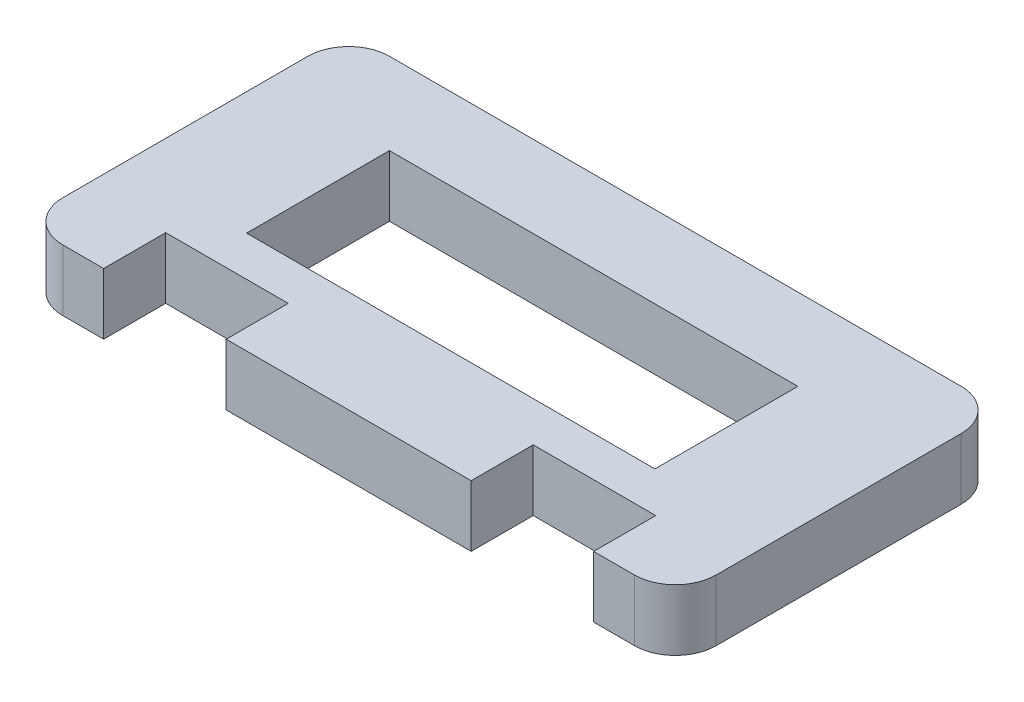
ISO-10303-21;
HEADER;
FILE_DESCRIPTION(('STEP AP214'),'2;1');
FILE_NAME('part.step','',(''),(''),'','','');
FILE_SCHEMA(('AUTOMOTIVE_DESIGN { 1 0 10303 214 1 1 1 1 }'));
ENDSEC;
DATA;
#1=APPLICATION_CONTEXT('core data for automotive mechanical design processes');
#2=APPLICATION_PROTOCOL_DEFINITION('international standard','automotive_design',2000,#1);
#3=PRODUCT_CONTEXT('',#1,'mechanical');
#4=PRODUCT('Part','Part','',(#3));
#5=PRODUCT_RELATED_PRODUCT_CATEGORY('part','',(#4));
#6=PRODUCT_DEFINITION_FORMATION('','',#4);
#7=PRODUCT_DEFINITION_CONTEXT('part definition',#1,'design');
#8=PRODUCT_DEFINITION('design','',#6,#7);
#9=PRODUCT_DEFINITION_SHAPE('','',#8);
#10=(LENGTH_UNIT() NAMED_UNIT(*) SI_UNIT(.MILLI.,.METRE.));
#11=(NAMED_UNIT(*) PLANE_ANGLE_UNIT() SI_UNIT($,.RADIAN.));
#12=(NAMED_UNIT(*) SI_UNIT($,.STERADIAN.) SOLID_ANGLE_UNIT());
#13=UNCERTAINTY_MEASURE_WITH_UNIT(LENGTH_MEASURE(1.E-05),#10,'distance_accuracy_value','');
#14=(GEOMETRIC_REPRESENTATION_CONTEXT(3) GLOBAL_UNCERTAINTY_ASSIGNED_CONTEXT((#13)) GLOBAL_UNIT_ASSIGNED_CONTEXT((#10,
#11,#12)) REPRESENTATION_CONTEXT('',''));
#15=CARTESIAN_POINT('',(0.,0.,0.));
#16=DIRECTION('',(0.,0.,1.));
#17=DIRECTION('',(1.,0.,0.));
#18=AXIS2_PLACEMENT_3D('',#15,#16,#17);
#19=CARTESIAN_POINT('',(-35.,7.5,15.));
#20=DIRECTION('',(0.,1.,0.));
#21=DIRECTION('',(0.,0.,1.));
#22=AXIS2_PLACEMENT_3D('',#19,#20,#21);
#23=PLANE('',#22);
#24=CARTESIAN_POINT('',(-35.,7.5,15.));
#25=DIRECTION('',(0.,1.,0.));
#26=DIRECTION('',(0.,0.,1.));
#27=AXIS2_PLACEMENT_3D('',#24,#25,#26);
#28=CIRCLE('',#27,5.);
#29=CARTESIAN_POINT('',(-40.,7.5,15.));
#30=VERTEX_POINT('',#29);
#31=CARTESIAN_POINT('',(-35.,7.5,20.));
#32=VERTEX_POINT('',#31);
#33=EDGE_CURVE('E225',#30,#32,#28,.T.);
#34=ORIENTED_EDGE('',*,*,#33,.T.);
#35=DIRECTION('',(1.,0.,0.));
#36=VECTOR('',#35,1.);
#37=CARTESIAN_POINT('',(-35.,7.5,20.));
#38=LINE('',#37,#36);
#39=CARTESIAN_POINT('',(-30.,7.5,20.));
#40=VERTEX_POINT('',#39);
#41=EDGE_CURVE('E229',#32,#40,#38,.T.);
#42=ORIENTED_EDGE('',*,*,#41,.T.);
#43=DIRECTION('',(0.,0.,-1.));
#44=VECTOR('',#43,1.);
#45=CARTESIAN_POINT('',(-30.,7.5,20.));
#46=LINE('',#45,#44);
#47=CARTESIAN_POINT('',(-30.,7.5,12.4));
#48=VERTEX_POINT('',#47);
#49=EDGE_CURVE('E233',#40,#48,#46,.T.);
#50=ORIENTED_EDGE('',*,*,#49,.T.);
#51=DIRECTION('',(1.,0.,0.));
#52=VECTOR('',#51,1.);
#53=CARTESIAN_POINT('',(-30.,7.5,12.4));
#54=LINE('',#53,#52);
#55=CARTESIAN_POINT('',(-15.,7.5,12.4));
#56=VERTEX_POINT('',#55);
#57=EDGE_CURVE('E236',#48,#56,#54,.T.);
#58=ORIENTED_EDGE('',*,*,#57,.T.);
#59=DIRECTION('',(0.,0.,1.));
#60=VECTOR('',#59,1.);
#61=CARTESIAN_POINT('',(-15.,7.5,12.4));
#62=LINE('',#61,#60);
#63=CARTESIAN_POINT('',(-15.,7.5,20.));
#64=VERTEX_POINT('',#63);
#65=EDGE_CURVE('E239',#56,#64,#62,.T.);
#66=ORIENTED_EDGE('',*,*,#65,.T.);
#67=DIRECTION('',(1.,0.,0.));
#68=VECTOR('',#67,1.);
#69=CARTESIAN_POINT('',(-15.,7.5,20.));
#70=LINE('',#69,#68);
#71=CARTESIAN_POINT('',(15.,7.5,20.));
#72=VERTEX_POINT('',#71);
#73=EDGE_CURVE('E242',#64,#72,#70,.T.);
#74=ORIENTED_EDGE('',*,*,#73,.T.);
#75=DIRECTION('',(0.,0.,-1.));
#76=VECTOR('',#75,1.);
#77=CARTESIAN_POINT('',(15.,7.5,12.4));
#78=LINE('',#77,#76);
#79=CARTESIAN_POINT('',(15.,7.5,12.4));
#80=VERTEX_POINT('',#79);
#81=EDGE_CURVE('E245',#72,#80,#78,.T.);
#82=ORIENTED_EDGE('',*,*,#81,.T.);
#83=DIRECTION('',(1.,0.,0.));
#84=VECTOR('',#83,1.);
#85=CARTESIAN_POINT('',(15.,7.5,12.4));
#86=LINE('',#85,#84);
#87=CARTESIAN_POINT('',(30.,7.5,12.4));
#88=VERTEX_POINT('',#87);
#89=EDGE_CURVE('E248',#80,#88,#86,.T.);
#90=ORIENTED_EDGE('',*,*,#89,.T.);
#91=DIRECTION('',(0.,0.,1.));
#92=VECTOR('',#91,1.);
#93=CARTESIAN_POINT('',(30.,7.5,20.));
#94=LINE('',#93,#92);
#95=CARTESIAN_POINT('',(30.,7.5,20.));
#96=VERTEX_POINT('',#95);
#97=EDGE_CURVE('E251',#88,#96,#94,.T.);
#98=ORIENTED_EDGE('',*,*,#97,.T.);
#99=DIRECTION('',(1.,0.,0.));
#100=VECTOR('',#99,1.);
#101=CARTESIAN_POINT('',(30.,7.5,20.));
#102=LINE('',#101,#100);
#103=CARTESIAN_POINT('',(35.,7.5,20.));
#104=VERTEX_POINT('',#103);
#105=EDGE_CURVE('E254',#96,#104,#102,.T.);
#106=ORIENTED_EDGE('',*,*,#105,.T.);
#107=CARTESIAN_POINT('',(35.,7.5,15.));
#108=DIRECTION('',(0.,1.,0.));
#109=DIRECTION('',(0.,0.,1.));
#110=AXIS2_PLACEMENT_3D('',#107,#108,#109);
#111=CIRCLE('',#110,5.);
#112=CARTESIAN_POINT('',(40.,7.5,15.));
#113=VERTEX_POINT('',#112);
#114=EDGE_CURVE('E257',#104,#113,#111,.T.);
#115=ORIENTED_EDGE('',*,*,#114,.T.);
#116=DIRECTION('',(0.,0.,-1.));
#117=VECTOR('',#116,1.);
#118=CARTESIAN_POINT('',(40.,7.5,-15.));
#119=LINE('',#118,#117);
#120=CARTESIAN_POINT('',(40.,7.5,-15.));
#121=VERTEX_POINT('',#120);
#122=EDGE_CURVE('E260',#113,#121,#119,.T.);
#123=ORIENTED_EDGE('',*,*,#122,.T.);
#124=CARTESIAN_POINT('',(35.,7.5,-15.));
#125=DIRECTION('',(0.,1.,0.));
#126=DIRECTION('',(0.,0.,-1.));
#127=AXIS2_PLACEMENT_3D('',#124,#125,#126);
#128=CIRCLE('',#127,5.);
#129=CARTESIAN_POINT('',(35.,7.5,-20.));
#130=VERTEX_POINT('',#129);
#131=EDGE_CURVE('E263',#121,#130,#128,.T.);
#132=ORIENTED_EDGE('',*,*,#131,.T.);
#133=DIRECTION('',(-1.,0.,0.));
#134=VECTOR('',#133,1.);
#135=CARTESIAN_POINT('',(-35.,7.5,-20.));
#136=LINE('',#135,#134);
#137=CARTESIAN_POINT('',(-35.,7.5,-20.));
#138=VERTEX_POINT('',#137);
#139=EDGE_CURVE('E266',#130,#138,#136,.T.);
#140=ORIENTED_EDGE('',*,*,#139,.T.);
#141=CARTESIAN_POINT('',(-35.,7.5,-15.));
#142=DIRECTION('',(0.,1.,0.));
#143=DIRECTION('',(0.,0.,1.));
#144=AXIS2_PLACEMENT_3D('',#141,#142,#143);
#145=CIRCLE('',#144,5.);
#146=CARTESIAN_POINT('',(-40.,7.5,-15.));
#147=VERTEX_POINT('',#146);
#148=EDGE_CURVE('E269',#138,#147,#145,.T.);
#149=ORIENTED_EDGE('',*,*,#148,.T.);
#150=DIRECTION('',(0.,0.,1.));
#151=VECTOR('',#150,1.);
#152=CARTESIAN_POINT('',(-40.,7.5,-15.));
#153=LINE('',#152,#151);
#154=EDGE_CURVE('E272',#147,#30,#153,.T.);
#155=ORIENTED_EDGE('',*,*,#154,.T.);
#156=EDGE_LOOP('',(#34,#42,#50,#58,#66,#74,#82,#90,#98,#106,#115,#123,#132,#140,#149,#155));
#157=FACE_BOUND('',#156,.T.);
#158=DIRECTION('',(-1.,0.,0.));
#159=VECTOR('',#158,1.);
#160=CARTESIAN_POINT('',(-25.,7.5,-10.));
#161=LINE('',#160,#159);
#162=CARTESIAN_POINT('',(25.,7.5,-10.));
#163=VERTEX_POINT('',#162);
#164=CARTESIAN_POINT('',(-25.,7.5,-10.));
#165=VERTEX_POINT('',#164);
#166=EDGE_CURVE('E186',#163,#165,#161,.T.);
#167=ORIENTED_EDGE('',*,*,#166,.F.);
#168=DIRECTION('',(0.,0.,-1.));
#169=VECTOR('',#168,1.);
#170=CARTESIAN_POINT('',(25.,7.5,-10.));
#171=LINE('',#170,#169);
#172=CARTESIAN_POINT('',(25.,7.5,7.5));
#173=VERTEX_POINT('',#172);
#174=EDGE_CURVE('E177',#173,#163,#171,.T.);
#175=ORIENTED_EDGE('',*,*,#174,.F.);
#176=DIRECTION('',(1.,0.,0.));
#177=VECTOR('',#176,1.);
#178=CARTESIAN_POINT('',(-25.,7.5,7.5));
#179=LINE('',#178,#177);
#180=CARTESIAN_POINT('',(-25.,7.5,7.5));
#181=VERTEX_POINT('',#180);
#182=EDGE_CURVE('E203',#181,#173,#179,.T.);
#183=ORIENTED_EDGE('',*,*,#182,.F.);
#184=DIRECTION('',(0.,0.,1.));
#185=VECTOR('',#184,1.);
#186=CARTESIAN_POINT('',(-25.,7.5,-10.));
#187=LINE('',#186,#185);
#188=EDGE_CURVE('E199',#165,#181,#187,.T.);
#189=ORIENTED_EDGE('',*,*,#188,.F.);
#190=EDGE_LOOP('',(#167,#175,#183,#189));
#191=FACE_BOUND('',#190,.T.);
#192=ADVANCED_FACE('F39',(#157,#191),#23,.T.);
#193=CARTESIAN_POINT('',(-35.,0.,15.));
#194=DIRECTION('',(0.,1.,0.));
#195=DIRECTION('',(0.,0.,1.));
#196=AXIS2_PLACEMENT_3D('',#193,#194,#195);
#197=PLANE('',#196);
#198=CARTESIAN_POINT('',(-35.,0.,15.));
#199=DIRECTION('',(0.,1.,0.));
#200=DIRECTION('',(0.,0.,1.));
#201=AXIS2_PLACEMENT_3D('',#198,#199,#200);
#202=CIRCLE('',#201,5.);
#203=CARTESIAN_POINT('',(-40.,0.,15.));
#204=VERTEX_POINT('',#203);
#205=CARTESIAN_POINT('',(-35.,0.,20.));
#206=VERTEX_POINT('',#205);
#207=EDGE_CURVE('E195',#204,#206,#202,.T.);
#208=ORIENTED_EDGE('',*,*,#207,.F.);
#209=DIRECTION('',(0.,0.,1.));
#210=VECTOR('',#209,1.);
#211=CARTESIAN_POINT('',(-40.,0.,-15.));
#212=LINE('',#211,#210);
#213=CARTESIAN_POINT('',(-40.,0.,-15.));
#214=VERTEX_POINT('',#213);
#215=EDGE_CURVE('E230',#214,#204,#212,.T.);
#216=ORIENTED_EDGE('',*,*,#215,.F.);
#217=CARTESIAN_POINT('',(-35.,0.,-15.));
#218=DIRECTION('',(0.,1.,0.));
#219=DIRECTION('',(0.,0.,1.));
#220=AXIS2_PLACEMENT_3D('',#217,#218,#219);
#221=CIRCLE('',#220,5.);
#222=CARTESIAN_POINT('',(-35.,0.,-20.));
#223=VERTEX_POINT('',#222);
#224=EDGE_CURVE('E318',#223,#214,#221,.T.);
#225=ORIENTED_EDGE('',*,*,#224,.F.);
#226=DIRECTION('',(-1.,0.,0.));
#227=VECTOR('',#226,1.);
#228=CARTESIAN_POINT('',(-35.,0.,-20.));
#229=LINE('',#228,#227);
#230=CARTESIAN_POINT('',(35.,0.,-20.));
#231=VERTEX_POINT('',#230);
#232=EDGE_CURVE('E315',#231,#223,#229,.T.);
#233=ORIENTED_EDGE('',*,*,#232,.F.);
#234=CARTESIAN_POINT('',(35.,0.,-15.));
#235=DIRECTION('',(0.,1.,0.));
#236=DIRECTION('',(0.,0.,-1.));
#237=AXIS2_PLACEMENT_3D('',#234,#235,#236);
#238=CIRCLE('',#237,5.);
#239=CARTESIAN_POINT('',(40.,0.,-15.));
#240=VERTEX_POINT('',#239);
#241=EDGE_CURVE('E312',#240,#231,#238,.T.);
#242=ORIENTED_EDGE('',*,*,#241,.F.);
#243=DIRECTION('',(0.,0.,-1.));
#244=VECTOR('',#243,1.);
#245=CARTESIAN_POINT('',(40.,0.,-15.));
#246=LINE('',#245,#244);
#247=CARTESIAN_POINT('',(40.,0.,15.));
#248=VERTEX_POINT('',#247);
#249=EDGE_CURVE('E309',#248,#240,#246,.T.);
#250=ORIENTED_EDGE('',*,*,#249,.F.);
#251=CARTESIAN_POINT('',(35.,0.,15.));
#252=DIRECTION('',(0.,1.,0.));
#253=DIRECTION('',(0.,0.,1.));
#254=AXIS2_PLACEMENT_3D('',#251,#252,#253);
#255=CIRCLE('',#254,5.);
#256=CARTESIAN_POINT('',(35.,0.,20.));
#257=VERTEX_POINT('',#256);
#258=EDGE_CURVE('E306',#257,#248,#255,.T.);
#259=ORIENTED_EDGE('',*,*,#258,.F.);
#260=DIRECTION('',(1.,0.,0.));
#261=VECTOR('',#260,1.);
#262=CARTESIAN_POINT('',(30.,0.,20.));
#263=LINE('',#262,#261);
#264=CARTESIAN_POINT('',(30.,0.,20.));
#265=VERTEX_POINT('',#264);
#266=EDGE_CURVE('E303',#265,#257,#263,.T.);
#267=ORIENTED_EDGE('',*,*,#266,.F.);
#268=DIRECTION('',(0.,0.,1.));
#269=VECTOR('',#268,1.);
#270=CARTESIAN_POINT('',(30.,0.,20.));
#271=LINE('',#270,#269);
#272=CARTESIAN_POINT('',(30.,0.,12.4));
#273=VERTEX_POINT('',#272);
#274=EDGE_CURVE('E300',#273,#265,#271,.T.);
#275=ORIENTED_EDGE('',*,*,#274,.F.);
#276=DIRECTION('',(1.,0.,0.));
#277=VECTOR('',#276,1.);
#278=CARTESIAN_POINT('',(15.,0.,12.4));
#279=LINE('',#278,#277);
#280=CARTESIAN_POINT('',(15.,0.,12.4));
#281=VERTEX_POINT('',#280);
#282=EDGE_CURVE('E297',#281,#273,#279,.T.);
#283=ORIENTED_EDGE('',*,*,#282,.F.);
#284=DIRECTION('',(0.,0.,-1.));
#285=VECTOR('',#284,1.);
#286=CARTESIAN_POINT('',(15.,0.,12.4));
#287=LINE('',#286,#285);
#288=CARTESIAN_POINT('',(15.,0.,20.));
#289=VERTEX_POINT('',#288);
#290=EDGE_CURVE('E294',#289,#281,#287,.T.);
#291=ORIENTED_EDGE('',*,*,#290,.F.);
#292=DIRECTION('',(1.,0.,0.));
#293=VECTOR('',#292,1.);
#294=CARTESIAN_POINT('',(-15.,0.,20.));
#295=LINE('',#294,#293);
#296=CARTESIAN_POINT('',(-15.,0.,20.));
#297=VERTEX_POINT('',#296);
#298=EDGE_CURVE('E291',#297,#289,#295,.T.);
#299=ORIENTED_EDGE('',*,*,#298,.F.);
#300=DIRECTION('',(0.,0.,1.));
#301=VECTOR('',#300,1.);
#302=CARTESIAN_POINT('',(-15.,0.,12.4));
#303=LINE('',#302,#301);
#304=CARTESIAN_POINT('',(-15.,0.,12.4));
#305=VERTEX_POINT('',#304);
#306=EDGE_CURVE('E288',#305,#297,#303,.T.);
#307=ORIENTED_EDGE('',*,*,#306,.F.);
#308=DIRECTION('',(1.,0.,0.));
#309=VECTOR('',#308,1.);
#310=CARTESIAN_POINT('',(-30.,0.,12.4));
#311=LINE('',#310,#309);
#312=CARTESIAN_POINT('',(-30.,0.,12.4));
#313=VERTEX_POINT('',#312);
#314=EDGE_CURVE('E285',#313,#305,#311,.T.);
#315=ORIENTED_EDGE('',*,*,#314,.F.);
#316=DIRECTION('',(0.,0.,-1.));
#317=VECTOR('',#316,1.);
#318=CARTESIAN_POINT('',(-30.,0.,20.));
#319=LINE('',#318,#317);
#320=CARTESIAN_POINT('',(-30.,0.,20.));
#321=VERTEX_POINT('',#320);
#322=EDGE_CURVE('E282',#321,#313,#319,.T.);
#323=ORIENTED_EDGE('',*,*,#322,.F.);
#324=DIRECTION('',(1.,0.,0.));
#325=VECTOR('',#324,1.);
#326=CARTESIAN_POINT('',(-35.,0.,20.));
#327=LINE('',#326,#325);
#328=EDGE_CURVE('E279',#206,#321,#327,.T.);
#329=ORIENTED_EDGE('',*,*,#328,.F.);
#330=EDGE_LOOP('',(#208,#216,#225,#233,#242,#250,#259,#267,#275,#283,#291,#299,#307,#315,#323,#329));
#331=FACE_BOUND('',#330,.T.);
#332=DIRECTION('',(0.,0.,-1.));
#333=VECTOR('',#332,1.);
#334=CARTESIAN_POINT('',(25.,0.,-10.));
#335=LINE('',#334,#333);
#336=CARTESIAN_POINT('',(25.,0.,7.5));
#337=VERTEX_POINT('',#336);
#338=CARTESIAN_POINT('',(25.,0.,-10.));
#339=VERTEX_POINT('',#338);
#340=EDGE_CURVE('E63',#337,#339,#335,.T.);
#341=ORIENTED_EDGE('',*,*,#340,.T.);
#342=DIRECTION('',(-1.,0.,0.));
#343=VECTOR('',#342,1.);
#344=CARTESIAN_POINT('',(-25.,0.,-10.));
#345=LINE('',#344,#343);
#346=CARTESIAN_POINT('',(-25.,0.,-10.));
#347=VERTEX_POINT('',#346);
#348=EDGE_CURVE('E193',#339,#347,#345,.T.);
#349=ORIENTED_EDGE('',*,*,#348,.T.);
#350=DIRECTION('',(0.,0.,1.));
#351=VECTOR('',#350,1.);
#352=CARTESIAN_POINT('',(-25.,0.,-10.));
#353=LINE('',#352,#351);
#354=CARTESIAN_POINT('',(-25.,0.,7.5));
#355=VERTEX_POINT('',#354);
#356=EDGE_CURVE('E212',#347,#355,#353,.T.);
#357=ORIENTED_EDGE('',*,*,#356,.T.);
#358=DIRECTION('',(1.,0.,0.));
#359=VECTOR('',#358,1.);
#360=CARTESIAN_POINT('',(-25.,0.,7.5));
#361=LINE('',#360,#359);
#362=EDGE_CURVE('E187',#355,#337,#361,.T.);
#363=ORIENTED_EDGE('',*,*,#362,.T.);
#364=EDGE_LOOP('',(#341,#349,#357,#363));
#365=FACE_BOUND('',#364,.T.);
#366=ADVANCED_FACE('F389',(#331,#365),#197,.F.);
#367=CARTESIAN_POINT('',(-35.,7.5,15.));
#368=DIRECTION('',(0.,-1.,0.));
#369=DIRECTION('',(0.,0.,-1.));
#370=AXIS2_PLACEMENT_3D('',#367,#368,#369);
#371=CYLINDRICAL_SURFACE('',#370,5.);
#372=ORIENTED_EDGE('',*,*,#207,.T.);
#373=DIRECTION('',(0.,-1.,0.));
#374=VECTOR('',#373,1.);
#375=CARTESIAN_POINT('',(-35.,7.5,20.));
#376=LINE('',#375,#374);
#377=EDGE_CURVE('E11',#32,#206,#376,.T.);
#378=ORIENTED_EDGE('',*,*,#377,.F.);
#379=ORIENTED_EDGE('',*,*,#33,.F.);
#380=DIRECTION('',(0.,-1.,0.));
#381=VECTOR('',#380,1.);
#382=CARTESIAN_POINT('',(-40.,7.5,15.));
#383=LINE('',#382,#381);
#384=EDGE_CURVE('E275',#30,#204,#383,.T.);
#385=ORIENTED_EDGE('',*,*,#384,.T.);
#386=EDGE_LOOP('',(#372,#378,#379,#385));
#387=FACE_BOUND('',#386,.T.);
#388=ADVANCED_FACE('F41',(#387),#371,.T.);
#389=CARTESIAN_POINT('',(-35.,7.5,20.));
#390=DIRECTION('',(0.,0.,-1.));
#391=DIRECTION('',(-1.,0.,0.));
#392=AXIS2_PLACEMENT_3D('',#389,#390,#391);
#393=PLANE('',#392);
#394=ORIENTED_EDGE('',*,*,#328,.T.);
#395=DIRECTION('',(0.,-1.,0.));
#396=VECTOR('',#395,1.);
#397=CARTESIAN_POINT('',(-30.,7.5,20.));
#398=LINE('',#397,#396);
#399=EDGE_CURVE('E48',#40,#321,#398,.T.);
#400=ORIENTED_EDGE('',*,*,#399,.F.);
#401=ORIENTED_EDGE('',*,*,#41,.F.);
#402=ORIENTED_EDGE('',*,*,#377,.T.);
#403=EDGE_LOOP('',(#394,#400,#401,#402));
#404=FACE_BOUND('',#403,.T.);
#405=ADVANCED_FACE('F406',(#404),#393,.F.);
#406=CARTESIAN_POINT('',(-30.,7.5,20.));
#407=DIRECTION('',(-1.,0.,0.));
#408=DIRECTION('',(0.,0.,1.));
#409=AXIS2_PLACEMENT_3D('',#406,#407,#408);
#410=PLANE('',#409);
#411=ORIENTED_EDGE('',*,*,#322,.T.);
#412=DIRECTION('',(0.,-1.,0.));
#413=VECTOR('',#412,1.);
#414=CARTESIAN_POINT('',(-30.,7.5,12.4));
#415=LINE('',#414,#413);
#416=EDGE_CURVE('E374',#48,#313,#415,.T.);
#417=ORIENTED_EDGE('',*,*,#416,.F.);
#418=ORIENTED_EDGE('',*,*,#49,.F.);
#419=ORIENTED_EDGE('',*,*,#399,.T.);
#420=EDGE_LOOP('',(#411,#417,#418,#419));
#421=FACE_BOUND('',#420,.T.);
#422=ADVANCED_FACE('F383',(#421),#410,.F.);
#423=CARTESIAN_POINT('',(-30.,7.5,12.4));
#424=DIRECTION('',(0.,0.,-1.));
#425=DIRECTION('',(-1.,0.,0.));
#426=AXIS2_PLACEMENT_3D('',#423,#424,#425);
#427=PLANE('',#426);
#428=ORIENTED_EDGE('',*,*,#314,.T.);
#429=DIRECTION('',(0.,-1.,0.));
#430=VECTOR('',#429,1.);
#431=CARTESIAN_POINT('',(-15.,7.5,12.4));
#432=LINE('',#431,#430);
#433=EDGE_CURVE('E370',#56,#305,#432,.T.);
#434=ORIENTED_EDGE('',*,*,#433,.F.);
#435=ORIENTED_EDGE('',*,*,#57,.F.);
#436=ORIENTED_EDGE('',*,*,#416,.T.);
#437=EDGE_LOOP('',(#428,#434,#435,#436));
#438=FACE_BOUND('',#437,.T.);
#439=ADVANCED_FACE('F395',(#438),#427,.F.);
#440=CARTESIAN_POINT('',(-15.,7.5,12.4));
#441=DIRECTION('',(1.,0.,0.));
#442=DIRECTION('',(0.,0.,-1.));
#443=AXIS2_PLACEMENT_3D('',#440,#441,#442);
#444=PLANE('',#443);
#445=ORIENTED_EDGE('',*,*,#306,.T.);
#446=DIRECTION('',(0.,-1.,0.));
#447=VECTOR('',#446,1.);
#448=CARTESIAN_POINT('',(-15.,7.5,20.));
#449=LINE('',#448,#447);
#450=EDGE_CURVE('E366',#64,#297,#449,.T.);
#451=ORIENTED_EDGE('',*,*,#450,.F.);
#452=ORIENTED_EDGE('',*,*,#65,.F.);
#453=ORIENTED_EDGE('',*,*,#433,.T.);
#454=EDGE_LOOP('',(#445,#451,#452,#453));
#455=FACE_BOUND('',#454,.T.);
#456=ADVANCED_FACE('F399',(#455),#444,.F.);
#457=CARTESIAN_POINT('',(-15.,7.5,20.));
#458=DIRECTION('',(0.,0.,-1.));
#459=DIRECTION('',(-1.,0.,0.));
#460=AXIS2_PLACEMENT_3D('',#457,#458,#459);
#461=PLANE('',#460);
#462=ORIENTED_EDGE('',*,*,#298,.T.);
#463=DIRECTION('',(0.,-1.,0.));
#464=VECTOR('',#463,1.);
#465=CARTESIAN_POINT('',(15.,7.5,20.));
#466=LINE('',#465,#464);
#467=EDGE_CURVE('E362',#72,#289,#466,.T.);
#468=ORIENTED_EDGE('',*,*,#467,.F.);
#469=ORIENTED_EDGE('',*,*,#73,.F.);
#470=ORIENTED_EDGE('',*,*,#450,.T.);
#471=EDGE_LOOP('',(#462,#468,#469,#470));
#472=FACE_BOUND('',#471,.T.);
#473=ADVANCED_FACE('F459',(#472),#461,.F.);
#474=CARTESIAN_POINT('',(15.,7.5,12.4));
#475=DIRECTION('',(-1.,0.,0.));
#476=DIRECTION('',(0.,0.,1.));
#477=AXIS2_PLACEMENT_3D('',#474,#475,#476);
#478=PLANE('',#477);
#479=ORIENTED_EDGE('',*,*,#290,.T.);
#480=DIRECTION('',(0.,-1.,0.));
#481=VECTOR('',#480,1.);
#482=CARTESIAN_POINT('',(15.,7.5,12.4));
#483=LINE('',#482,#481);
#484=EDGE_CURVE('E358',#80,#281,#483,.T.);
#485=ORIENTED_EDGE('',*,*,#484,.F.);
#486=ORIENTED_EDGE('',*,*,#81,.F.);
#487=ORIENTED_EDGE('',*,*,#467,.T.);
#488=EDGE_LOOP('',(#479,#485,#486,#487));
#489=FACE_BOUND('',#488,.T.);
#490=ADVANCED_FACE('F456',(#489),#478,.F.);
#491=CARTESIAN_POINT('',(15.,7.5,12.4));
#492=DIRECTION('',(0.,0.,-1.));
#493=DIRECTION('',(-1.,0.,0.));
#494=AXIS2_PLACEMENT_3D('',#491,#492,#493);
#495=PLANE('',#494);
#496=ORIENTED_EDGE('',*,*,#282,.T.);
#497=DIRECTION('',(0.,-1.,0.));
#498=VECTOR('',#497,1.);
#499=CARTESIAN_POINT('',(30.,7.5,12.4));
#500=LINE('',#499,#498);
#501=EDGE_CURVE('E354',#88,#273,#500,.T.);
#502=ORIENTED_EDGE('',*,*,#501,.F.);
#503=ORIENTED_EDGE('',*,*,#89,.F.);
#504=ORIENTED_EDGE('',*,*,#484,.T.);
#505=EDGE_LOOP('',(#496,#502,#503,#504));
#506=FACE_BOUND('',#505,.T.);
#507=ADVANCED_FACE('F452',(#506),#495,.F.);
#508=CARTESIAN_POINT('',(30.,7.5,20.));
#509=DIRECTION('',(1.,0.,0.));
#510=DIRECTION('',(0.,0.,-1.));
#511=AXIS2_PLACEMENT_3D('',#508,#509,#510);
#512=PLANE('',#511);
#513=ORIENTED_EDGE('',*,*,#274,.T.);
#514=DIRECTION('',(0.,-1.,0.));
#515=VECTOR('',#514,1.);
#516=CARTESIAN_POINT('',(30.,7.5,20.));
#517=LINE('',#516,#515);
#518=EDGE_CURVE('E350',#96,#265,#517,.T.);
#519=ORIENTED_EDGE('',*,*,#518,.F.);
#520=ORIENTED_EDGE('',*,*,#97,.F.);
#521=ORIENTED_EDGE('',*,*,#501,.T.);
#522=EDGE_LOOP('',(#513,#519,#520,#521));
#523=FACE_BOUND('',#522,.T.);
#524=ADVANCED_FACE('F448',(#523),#512,.F.);
#525=CARTESIAN_POINT('',(30.,7.5,20.));
#526=DIRECTION('',(0.,0.,-1.));
#527=DIRECTION('',(-1.,0.,0.));
#528=AXIS2_PLACEMENT_3D('',#525,#526,#527);
#529=PLANE('',#528);
#530=ORIENTED_EDGE('',*,*,#266,.T.);
#531=DIRECTION('',(0.,-1.,0.));
#532=VECTOR('',#531,1.);
#533=CARTESIAN_POINT('',(35.,7.5,20.));
#534=LINE('',#533,#532);
#535=EDGE_CURVE('E346',#104,#257,#534,.T.);
#536=ORIENTED_EDGE('',*,*,#535,.F.);
#537=ORIENTED_EDGE('',*,*,#105,.F.);
#538=ORIENTED_EDGE('',*,*,#518,.T.);
#539=EDGE_LOOP('',(#530,#536,#537,#538));
#540=FACE_BOUND('',#539,.T.);
#541=ADVANCED_FACE('F443',(#540),#529,.F.);
#542=CARTESIAN_POINT('',(35.,7.5,15.));
#543=DIRECTION('',(0.,-1.,0.));
#544=DIRECTION('',(0.,0.,-1.));
#545=AXIS2_PLACEMENT_3D('',#542,#543,#544);
#546=CYLINDRICAL_SURFACE('',#545,5.);
#547=ORIENTED_EDGE('',*,*,#258,.T.);
#548=DIRECTION('',(0.,-1.,0.));
#549=VECTOR('',#548,1.);
#550=CARTESIAN_POINT('',(40.,7.5,15.));
#551=LINE('',#550,#549);
#552=EDGE_CURVE('E342',#113,#248,#551,.T.);
#553=ORIENTED_EDGE('',*,*,#552,.F.);
#554=ORIENTED_EDGE('',*,*,#114,.F.);
#555=ORIENTED_EDGE('',*,*,#535,.T.);
#556=EDGE_LOOP('',(#547,#553,#554,#555));
#557=FACE_BOUND('',#556,.T.);
#558=ADVANCED_FACE('F437',(#557),#546,.T.);
#559=CARTESIAN_POINT('',(40.,7.5,-15.));
#560=DIRECTION('',(-1.,0.,0.));
#561=DIRECTION('',(0.,0.,1.));
#562=AXIS2_PLACEMENT_3D('',#559,#560,#561);
#563=PLANE('',#562);
#564=ORIENTED_EDGE('',*,*,#249,.T.);
#565=DIRECTION('',(0.,-1.,0.));
#566=VECTOR('',#565,1.);
#567=CARTESIAN_POINT('',(40.,7.5,-15.));
#568=LINE('',#567,#566);
#569=EDGE_CURVE('E338',#121,#240,#568,.T.);
#570=ORIENTED_EDGE('',*,*,#569,.F.);
#571=ORIENTED_EDGE('',*,*,#122,.F.);
#572=ORIENTED_EDGE('',*,*,#552,.T.);
#573=EDGE_LOOP('',(#564,#570,#571,#572));
#574=FACE_BOUND('',#573,.T.);
#575=ADVANCED_FACE('F433',(#574),#563,.F.);
#576=CARTESIAN_POINT('',(35.,7.5,-15.));
#577=DIRECTION('',(0.,-1.,0.));
#578=DIRECTION('',(0.,0.,-1.));
#579=AXIS2_PLACEMENT_3D('',#576,#577,#578);
#580=CYLINDRICAL_SURFACE('',#579,5.);
#581=ORIENTED_EDGE('',*,*,#241,.T.);
#582=DIRECTION('',(0.,-1.,0.));
#583=VECTOR('',#582,1.);
#584=CARTESIAN_POINT('',(35.,7.5,-20.));
#585=LINE('',#584,#583);
#586=EDGE_CURVE('E334',#130,#231,#585,.T.);
#587=ORIENTED_EDGE('',*,*,#586,.F.);
#588=ORIENTED_EDGE('',*,*,#131,.F.);
#589=ORIENTED_EDGE('',*,*,#569,.T.);
#590=EDGE_LOOP('',(#581,#587,#588,#589));
#591=FACE_BOUND('',#590,.T.);
#592=ADVANCED_FACE('F428',(#591),#580,.T.);
#593=CARTESIAN_POINT('',(-35.,7.5,-20.));
#594=DIRECTION('',(0.,0.,1.));
#595=DIRECTION('',(1.,0.,0.));
#596=AXIS2_PLACEMENT_3D('',#593,#594,#595);
#597=PLANE('',#596);
#598=ORIENTED_EDGE('',*,*,#232,.T.);
#599=DIRECTION('',(0.,-1.,0.));
#600=VECTOR('',#599,1.);
#601=CARTESIAN_POINT('',(-35.,7.5,-20.));
#602=LINE('',#601,#600);
#603=EDGE_CURVE('E330',#138,#223,#602,.T.);
#604=ORIENTED_EDGE('',*,*,#603,.F.);
#605=ORIENTED_EDGE('',*,*,#139,.F.);
#606=ORIENTED_EDGE('',*,*,#586,.T.);
#607=EDGE_LOOP('',(#598,#604,#605,#606));
#608=FACE_BOUND('',#607,.T.);
#609=ADVANCED_FACE('F422',(#608),#597,.F.);
#610=CARTESIAN_POINT('',(-35.,7.5,-15.));
#611=DIRECTION('',(0.,-1.,0.));
#612=DIRECTION('',(0.,0.,-1.));
#613=AXIS2_PLACEMENT_3D('',#610,#611,#612);
#614=CYLINDRICAL_SURFACE('',#613,5.);
#615=ORIENTED_EDGE('',*,*,#224,.T.);
#616=DIRECTION('',(0.,-1.,0.));
#617=VECTOR('',#616,1.);
#618=CARTESIAN_POINT('',(-40.,7.5,-15.));
#619=LINE('',#618,#617);
#620=EDGE_CURVE('E326',#147,#214,#619,.T.);
#621=ORIENTED_EDGE('',*,*,#620,.F.);
#622=ORIENTED_EDGE('',*,*,#148,.F.);
#623=ORIENTED_EDGE('',*,*,#603,.T.);
#624=EDGE_LOOP('',(#615,#621,#622,#623));
#625=FACE_BOUND('',#624,.T.);
#626=ADVANCED_FACE('F418',(#625),#614,.T.);
#627=CARTESIAN_POINT('',(-40.,7.5,-15.));
#628=DIRECTION('',(1.,0.,0.));
#629=DIRECTION('',(0.,0.,-1.));
#630=AXIS2_PLACEMENT_3D('',#627,#628,#629);
#631=PLANE('',#630);
#632=ORIENTED_EDGE('',*,*,#215,.T.);
#633=ORIENTED_EDGE('',*,*,#384,.F.);
#634=ORIENTED_EDGE('',*,*,#154,.F.);
#635=ORIENTED_EDGE('',*,*,#620,.T.);
#636=EDGE_LOOP('',(#632,#633,#634,#635));
#637=FACE_BOUND('',#636,.T.);
#638=ADVANCED_FACE('F413',(#637),#631,.F.);
#639=CARTESIAN_POINT('',(25.,7.5,-10.));
#640=DIRECTION('',(-1.,0.,0.));
#641=DIRECTION('',(0.,0.,1.));
#642=AXIS2_PLACEMENT_3D('',#639,#640,#641);
#643=PLANE('',#642);
#644=ORIENTED_EDGE('',*,*,#340,.F.);
#645=DIRECTION('',(0.,-1.,0.));
#646=VECTOR('',#645,1.);
#647=CARTESIAN_POINT('',(25.,7.5,7.5));
#648=LINE('',#647,#646);
#649=EDGE_CURVE('E181',#173,#337,#648,.T.);
#650=ORIENTED_EDGE('',*,*,#649,.F.);
#651=ORIENTED_EDGE('',*,*,#174,.T.);
#652=DIRECTION('',(0.,-1.,0.));
#653=VECTOR('',#652,1.);
#654=CARTESIAN_POINT('',(25.,7.5,-10.));
#655=LINE('',#654,#653);
#656=EDGE_CURVE('E180',#163,#339,#655,.T.);
#657=ORIENTED_EDGE('',*,*,#656,.T.);
#658=EDGE_LOOP('',(#644,#650,#651,#657));
#659=FACE_BOUND('',#658,.T.);
#660=ADVANCED_FACE('F179',(#659),#643,.T.);
#661=CARTESIAN_POINT('',(-25.,7.5,-10.));
#662=DIRECTION('',(0.,0.,1.));
#663=DIRECTION('',(1.,0.,0.));
#664=AXIS2_PLACEMENT_3D('',#661,#662,#663);
#665=PLANE('',#664);
#666=ORIENTED_EDGE('',*,*,#348,.F.);
#667=ORIENTED_EDGE('',*,*,#656,.F.);
#668=ORIENTED_EDGE('',*,*,#166,.T.);
#669=DIRECTION('',(0.,-1.,0.));
#670=VECTOR('',#669,1.);
#671=CARTESIAN_POINT('',(-25.,7.5,-10.));
#672=LINE('',#671,#670);
#673=EDGE_CURVE('E196',#165,#347,#672,.T.);
#674=ORIENTED_EDGE('',*,*,#673,.T.);
#675=EDGE_LOOP('',(#666,#667,#668,#674));
#676=FACE_BOUND('',#675,.T.);
#677=ADVANCED_FACE('F190',(#676),#665,.T.);
#678=CARTESIAN_POINT('',(-25.,7.5,-10.));
#679=DIRECTION('',(1.,0.,0.));
#680=DIRECTION('',(0.,0.,-1.));
#681=AXIS2_PLACEMENT_3D('',#678,#679,#680);
#682=PLANE('',#681);
#683=ORIENTED_EDGE('',*,*,#356,.F.);
#684=ORIENTED_EDGE('',*,*,#673,.F.);
#685=ORIENTED_EDGE('',*,*,#188,.T.);
#686=DIRECTION('',(0.,-1.,0.));
#687=VECTOR('',#686,1.);
#688=CARTESIAN_POINT('',(-25.,7.5,7.5));
#689=LINE('',#688,#687);
#690=EDGE_CURVE('E55',#181,#355,#689,.T.);
#691=ORIENTED_EDGE('',*,*,#690,.T.);
#692=EDGE_LOOP('',(#683,#684,#685,#691));
#693=FACE_BOUND('',#692,.T.);
#694=ADVANCED_FACE('F541',(#693),#682,.T.);
#695=CARTESIAN_POINT('',(-25.,7.5,7.5));
#696=DIRECTION('',(0.,0.,-1.));
#697=DIRECTION('',(-1.,0.,0.));
#698=AXIS2_PLACEMENT_3D('',#695,#696,#697);
#699=PLANE('',#698);
#700=ORIENTED_EDGE('',*,*,#362,.F.);
#701=ORIENTED_EDGE('',*,*,#690,.F.);
#702=ORIENTED_EDGE('',*,*,#182,.T.);
#703=ORIENTED_EDGE('',*,*,#649,.T.);
#704=EDGE_LOOP('',(#700,#701,#702,#703));
#705=FACE_BOUND('',#704,.T.);
#706=ADVANCED_FACE('F547',(#705),#699,.T.);
#707=CLOSED_SHELL('',(#192,#366,#388,#405,#422,#439,#456,#473,#490,#507,#524,#541,#558,#575,
#592,#609,#626,#638,#660,#677,#694,#706));
#708=MANIFOLD_SOLID_BREP('B2',#707);
#709=ADVANCED_BREP_SHAPE_REPRESENTATION('',(#18,#708),#14);
#710=SHAPE_DEFINITION_REPRESENTATION(#9,#709);
ENDSEC;
END-ISO-10303-21;
